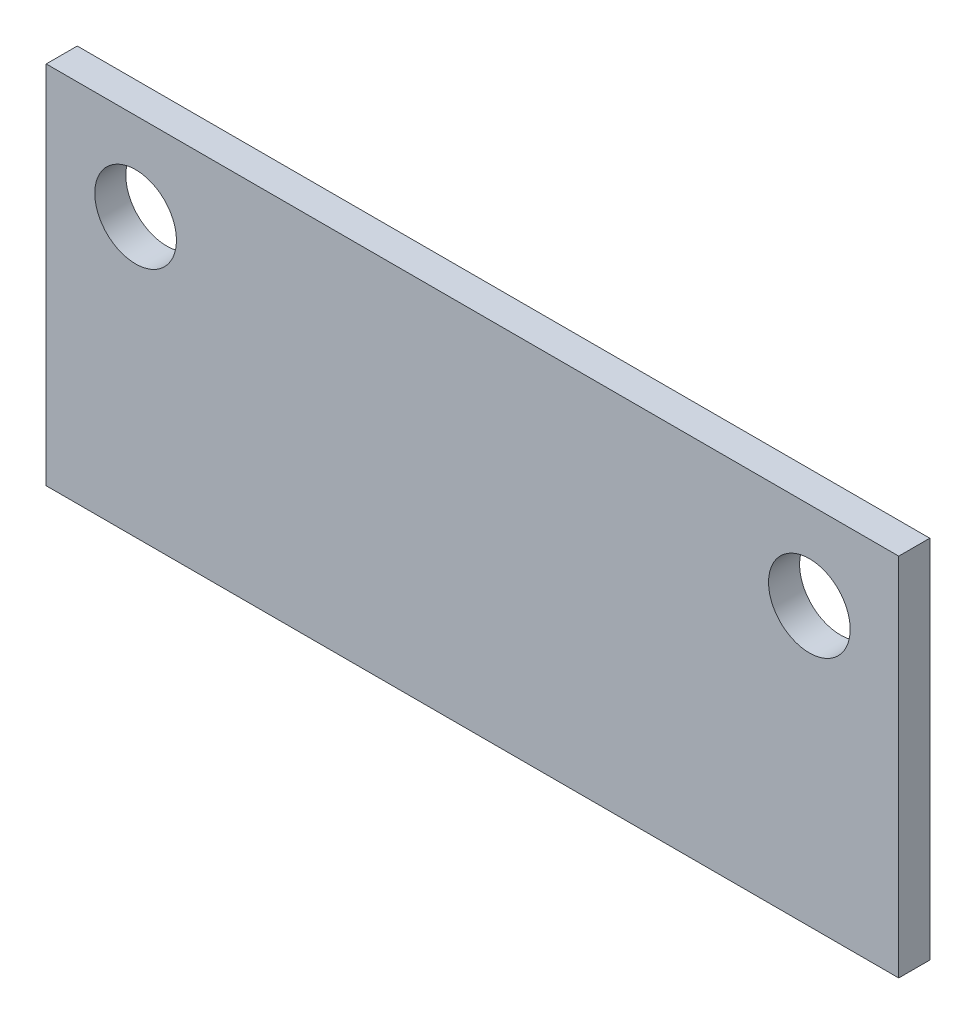
ISO-10303-21;
HEADER;
FILE_DESCRIPTION(('STEP AP214'),'2;1');
FILE_NAME('part.step','',(''),(''),'','','');
FILE_SCHEMA(('AUTOMOTIVE_DESIGN { 1 0 10303 214 1 1 1 1 }'));
ENDSEC;
DATA;
#1=APPLICATION_CONTEXT('core data for automotive mechanical design processes');
#2=APPLICATION_PROTOCOL_DEFINITION('international standard','automotive_design',2000,#1);
#3=PRODUCT_CONTEXT('',#1,'mechanical');
#4=PRODUCT('Part','Part','',(#3));
#5=PRODUCT_RELATED_PRODUCT_CATEGORY('part','',(#4));
#6=PRODUCT_DEFINITION_FORMATION('','',#4);
#7=PRODUCT_DEFINITION_CONTEXT('part definition',#1,'design');
#8=PRODUCT_DEFINITION('design','',#6,#7);
#9=PRODUCT_DEFINITION_SHAPE('','',#8);
#10=(LENGTH_UNIT() NAMED_UNIT(*) SI_UNIT(.MILLI.,.METRE.));
#11=(NAMED_UNIT(*) PLANE_ANGLE_UNIT() SI_UNIT($,.RADIAN.));
#12=(NAMED_UNIT(*) SI_UNIT($,.STERADIAN.) SOLID_ANGLE_UNIT());
#13=UNCERTAINTY_MEASURE_WITH_UNIT(LENGTH_MEASURE(1.E-05),#10,'distance_accuracy_value','');
#14=(GEOMETRIC_REPRESENTATION_CONTEXT(3) GLOBAL_UNCERTAINTY_ASSIGNED_CONTEXT((#13)) GLOBAL_UNIT_ASSIGNED_CONTEXT((#10,
#11,#12)) REPRESENTATION_CONTEXT('',''));
#15=CARTESIAN_POINT('',(0.,0.,0.));
#16=DIRECTION('',(0.,0.,1.));
#17=DIRECTION('',(1.,0.,0.));
#18=AXIS2_PLACEMENT_3D('',#15,#16,#17);
#19=CARTESIAN_POINT('',(0.,0.,0.9652));
#20=DIRECTION('',(0.,0.,-1.));
#21=DIRECTION('',(-1.,0.,0.));
#22=AXIS2_PLACEMENT_3D('',#19,#20,#21);
#23=PLANE('',#22);
#24=DIRECTION('',(0.,-1.,0.));
#25=VECTOR('',#24,1.);
#26=CARTESIAN_POINT('',(0.,0.,0.9652));
#27=LINE('',#26,#25);
#28=CARTESIAN_POINT('',(0.,11.3633355279812,0.9652));
#29=VERTEX_POINT('',#28);
#30=CARTESIAN_POINT('',(0.,0.,0.9652));
#31=VERTEX_POINT('',#30);
#32=EDGE_CURVE('E85',#29,#31,#27,.T.);
#33=ORIENTED_EDGE('',*,*,#32,.T.);
#34=DIRECTION('',(1.,0.,0.));
#35=VECTOR('',#34,1.);
#36=CARTESIAN_POINT('',(0.,0.,0.9652));
#37=LINE('',#36,#35);
#38=CARTESIAN_POINT('',(26.5144495652895,0.,0.9652));
#39=VERTEX_POINT('',#38);
#40=EDGE_CURVE('E80',#31,#39,#37,.T.);
#41=ORIENTED_EDGE('',*,*,#40,.T.);
#42=DIRECTION('',(0.,1.,0.));
#43=VECTOR('',#42,1.);
#44=CARTESIAN_POINT('',(26.5144495652895,0.,0.9652));
#45=LINE('',#44,#43);
#46=CARTESIAN_POINT('',(26.5144495652895,11.3633355279812,0.9652));
#47=VERTEX_POINT('',#46);
#48=EDGE_CURVE('E83',#39,#47,#45,.T.);
#49=ORIENTED_EDGE('',*,*,#48,.T.);
#50=DIRECTION('',(-1.,0.,0.));
#51=VECTOR('',#50,1.);
#52=CARTESIAN_POINT('',(0.,11.3633355279812,0.9652));
#53=LINE('',#52,#51);
#54=EDGE_CURVE('E50',#47,#29,#53,.T.);
#55=ORIENTED_EDGE('',*,*,#54,.T.);
#56=EDGE_LOOP('',(#33,#41,#49,#55));
#57=FACE_BOUND('',#56,.T.);
#58=CARTESIAN_POINT('',(2.77972478264474,8.636,0.9652));
#59=DIRECTION('',(0.,0.,1.));
#60=DIRECTION('',(1.,0.,0.));
#61=AXIS2_PLACEMENT_3D('',#58,#59,#60);
#62=CIRCLE('',#61,1.27);
#63=CARTESIAN_POINT('',(1.50972478264474,8.636,0.9652));
#64=VERTEX_POINT('',#63);
#65=EDGE_CURVE('E100',#64,#64,#62,.T.);
#66=ORIENTED_EDGE('',*,*,#65,.F.);
#67=EDGE_LOOP('',(#66));
#68=FACE_BOUND('',#67,.T.);
#69=CARTESIAN_POINT('',(23.7347247826447,8.636,0.9652));
#70=DIRECTION('',(0.,0.,1.));
#71=DIRECTION('',(1.,0.,0.));
#72=AXIS2_PLACEMENT_3D('',#69,#70,#71);
#73=CIRCLE('',#72,1.27);
#74=CARTESIAN_POINT('',(22.4647247826447,8.636,0.9652));
#75=VERTEX_POINT('',#74);
#76=EDGE_CURVE('E115',#75,#75,#73,.T.);
#77=ORIENTED_EDGE('',*,*,#76,.F.);
#78=EDGE_LOOP('',(#77));
#79=FACE_BOUND('',#78,.T.);
#80=ADVANCED_FACE('F33',(#57,#68,#79),#23,.F.);
#81=CARTESIAN_POINT('',(0.,0.,0.));
#82=DIRECTION('',(0.,0.,-1.));
#83=DIRECTION('',(-1.,0.,0.));
#84=AXIS2_PLACEMENT_3D('',#81,#82,#83);
#85=PLANE('',#84);
#86=CARTESIAN_POINT('',(2.77972478264474,8.636,0.));
#87=DIRECTION('',(0.,0.,1.));
#88=DIRECTION('',(1.,0.,0.));
#89=AXIS2_PLACEMENT_3D('',#86,#87,#88);
#90=CIRCLE('',#89,1.27);
#91=CARTESIAN_POINT('',(1.50972478264474,8.636,0.));
#92=VERTEX_POINT('',#91);
#93=EDGE_CURVE('E112',#92,#92,#90,.T.);
#94=ORIENTED_EDGE('',*,*,#93,.T.);
#95=EDGE_LOOP('',(#94));
#96=FACE_BOUND('',#95,.T.);
#97=DIRECTION('',(0.,-1.,0.));
#98=VECTOR('',#97,1.);
#99=CARTESIAN_POINT('',(0.,0.,0.));
#100=LINE('',#99,#98);
#101=CARTESIAN_POINT('',(0.,11.3633355279812,0.));
#102=VERTEX_POINT('',#101);
#103=CARTESIAN_POINT('',(0.,0.,0.));
#104=VERTEX_POINT('',#103);
#105=EDGE_CURVE('E97',#102,#104,#100,.T.);
#106=ORIENTED_EDGE('',*,*,#105,.F.);
#107=DIRECTION('',(-1.,0.,0.));
#108=VECTOR('',#107,1.);
#109=CARTESIAN_POINT('',(0.,11.3633355279812,0.));
#110=LINE('',#109,#108);
#111=CARTESIAN_POINT('',(26.5144495652895,11.3633355279812,0.));
#112=VERTEX_POINT('',#111);
#113=EDGE_CURVE('E73',#112,#102,#110,.T.);
#114=ORIENTED_EDGE('',*,*,#113,.F.);
#115=DIRECTION('',(0.,1.,0.));
#116=VECTOR('',#115,1.);
#117=CARTESIAN_POINT('',(26.5144495652895,0.,0.));
#118=LINE('',#117,#116);
#119=CARTESIAN_POINT('',(26.5144495652895,0.,0.));
#120=VERTEX_POINT('',#119);
#121=EDGE_CURVE('E67',#120,#112,#118,.T.);
#122=ORIENTED_EDGE('',*,*,#121,.F.);
#123=DIRECTION('',(1.,0.,0.));
#124=VECTOR('',#123,1.);
#125=CARTESIAN_POINT('',(0.,0.,0.));
#126=LINE('',#125,#124);
#127=EDGE_CURVE('E89',#104,#120,#126,.T.);
#128=ORIENTED_EDGE('',*,*,#127,.F.);
#129=EDGE_LOOP('',(#106,#114,#122,#128));
#130=FACE_BOUND('',#129,.T.);
#131=CARTESIAN_POINT('',(23.7347247826447,8.636,0.));
#132=DIRECTION('',(0.,0.,1.));
#133=DIRECTION('',(1.,0.,0.));
#134=AXIS2_PLACEMENT_3D('',#131,#132,#133);
#135=CIRCLE('',#134,1.27);
#136=CARTESIAN_POINT('',(22.4647247826447,8.636,0.));
#137=VERTEX_POINT('',#136);
#138=EDGE_CURVE('E118',#137,#137,#135,.T.);
#139=ORIENTED_EDGE('',*,*,#138,.T.);
#140=EDGE_LOOP('',(#139));
#141=FACE_BOUND('',#140,.T.);
#142=ADVANCED_FACE('F108',(#96,#130,#141),#85,.T.);
#143=CARTESIAN_POINT('',(0.,0.,0.9652));
#144=DIRECTION('',(1.,0.,0.));
#145=DIRECTION('',(0.,0.,-1.));
#146=AXIS2_PLACEMENT_3D('',#143,#144,#145);
#147=PLANE('',#146);
#148=ORIENTED_EDGE('',*,*,#105,.T.);
#149=DIRECTION('',(0.,0.,-1.));
#150=VECTOR('',#149,1.);
#151=CARTESIAN_POINT('',(0.,0.,0.9652));
#152=LINE('',#151,#150);
#153=EDGE_CURVE('E11',#31,#104,#152,.T.);
#154=ORIENTED_EDGE('',*,*,#153,.F.);
#155=ORIENTED_EDGE('',*,*,#32,.F.);
#156=DIRECTION('',(0.,0.,-1.));
#157=VECTOR('',#156,1.);
#158=CARTESIAN_POINT('',(0.,11.3633355279812,0.9652));
#159=LINE('',#158,#157);
#160=EDGE_CURVE('E93',#29,#102,#159,.T.);
#161=ORIENTED_EDGE('',*,*,#160,.T.);
#162=EDGE_LOOP('',(#148,#154,#155,#161));
#163=FACE_BOUND('',#162,.T.);
#164=ADVANCED_FACE('F35',(#163),#147,.F.);
#165=CARTESIAN_POINT('',(0.,0.,0.9652));
#166=DIRECTION('',(0.,1.,0.));
#167=DIRECTION('',(0.,0.,1.));
#168=AXIS2_PLACEMENT_3D('',#165,#166,#167);
#169=PLANE('',#168);
#170=ORIENTED_EDGE('',*,*,#127,.T.);
#171=DIRECTION('',(0.,0.,-1.));
#172=VECTOR('',#171,1.);
#173=CARTESIAN_POINT('',(26.5144495652895,0.,0.9652));
#174=LINE('',#173,#172);
#175=EDGE_CURVE('E42',#39,#120,#174,.T.);
#176=ORIENTED_EDGE('',*,*,#175,.F.);
#177=ORIENTED_EDGE('',*,*,#40,.F.);
#178=ORIENTED_EDGE('',*,*,#153,.T.);
#179=EDGE_LOOP('',(#170,#176,#177,#178));
#180=FACE_BOUND('',#179,.T.);
#181=ADVANCED_FACE('F88',(#180),#169,.F.);
#182=CARTESIAN_POINT('',(26.5144495652895,0.,0.9652));
#183=DIRECTION('',(-1.,0.,0.));
#184=DIRECTION('',(0.,0.,1.));
#185=AXIS2_PLACEMENT_3D('',#182,#183,#184);
#186=PLANE('',#185);
#187=ORIENTED_EDGE('',*,*,#121,.T.);
#188=DIRECTION('',(0.,0.,-1.));
#189=VECTOR('',#188,1.);
#190=CARTESIAN_POINT('',(26.5144495652895,11.3633355279812,0.9652));
#191=LINE('',#190,#189);
#192=EDGE_CURVE('E90',#47,#112,#191,.T.);
#193=ORIENTED_EDGE('',*,*,#192,.F.);
#194=ORIENTED_EDGE('',*,*,#48,.F.);
#195=ORIENTED_EDGE('',*,*,#175,.T.);
#196=EDGE_LOOP('',(#187,#193,#194,#195));
#197=FACE_BOUND('',#196,.T.);
#198=ADVANCED_FACE('F91',(#197),#186,.F.);
#199=CARTESIAN_POINT('',(0.,11.3633355279812,0.9652));
#200=DIRECTION('',(0.,-1.,0.));
#201=DIRECTION('',(0.,0.,-1.));
#202=AXIS2_PLACEMENT_3D('',#199,#200,#201);
#203=PLANE('',#202);
#204=ORIENTED_EDGE('',*,*,#113,.T.);
#205=ORIENTED_EDGE('',*,*,#160,.F.);
#206=ORIENTED_EDGE('',*,*,#54,.F.);
#207=ORIENTED_EDGE('',*,*,#192,.T.);
#208=EDGE_LOOP('',(#204,#205,#206,#207));
#209=FACE_BOUND('',#208,.T.);
#210=ADVANCED_FACE('F105',(#209),#203,.F.);
#211=CARTESIAN_POINT('',(2.77972478264474,8.636,0.9652));
#212=DIRECTION('',(0.,0.,-1.));
#213=DIRECTION('',(-1.,0.,0.));
#214=AXIS2_PLACEMENT_3D('',#211,#212,#213);
#215=CYLINDRICAL_SURFACE('',#214,1.27);
#216=CARTESIAN_POINT('',(1.50972478264474,8.636,0.9652));
#217=CARTESIAN_POINT('',(1.50972478264474,8.636,0.955145833333333));
#218=CARTESIAN_POINT('',(1.50972478264474,8.636,0.945091666666667));
#219=CARTESIAN_POINT('',(1.50972478264474,8.636,0.924983333333333));
#220=CARTESIAN_POINT('',(1.50972478264474,8.636,0.914929166666667));
#221=CARTESIAN_POINT('',(1.50972478264474,8.636,0.894820833333333));
#222=CARTESIAN_POINT('',(1.50972478264474,8.636,0.884766666666667));
#223=CARTESIAN_POINT('',(1.50972478264474,8.636,0.864658333333333));
#224=CARTESIAN_POINT('',(1.50972478264474,8.636,0.854604166666667));
#225=CARTESIAN_POINT('',(1.50972478264474,8.636,0.834495833333333));
#226=CARTESIAN_POINT('',(1.50972478264474,8.636,0.824441666666667));
#227=CARTESIAN_POINT('',(1.50972478264474,8.636,0.804333333333333));
#228=CARTESIAN_POINT('',(1.50972478264474,8.636,0.794279166666667));
#229=CARTESIAN_POINT('',(1.50972478264474,8.636,0.774170833333333));
#230=CARTESIAN_POINT('',(1.50972478264474,8.636,0.764116666666667));
#231=CARTESIAN_POINT('',(1.50972478264474,8.636,0.744008333333333));
#232=CARTESIAN_POINT('',(1.50972478264474,8.636,0.733954166666667));
#233=CARTESIAN_POINT('',(1.50972478264474,8.636,0.713845833333333));
#234=CARTESIAN_POINT('',(1.50972478264474,8.636,0.703791666666667));
#235=CARTESIAN_POINT('',(1.50972478264474,8.636,0.683683333333333));
#236=CARTESIAN_POINT('',(1.50972478264474,8.636,0.673629166666667));
#237=CARTESIAN_POINT('',(1.50972478264474,8.636,0.653520833333333));
#238=CARTESIAN_POINT('',(1.50972478264474,8.636,0.643466666666667));
#239=CARTESIAN_POINT('',(1.50972478264474,8.636,0.623358333333333));
#240=CARTESIAN_POINT('',(1.50972478264474,8.636,0.613304166666667));
#241=CARTESIAN_POINT('',(1.50972478264474,8.636,0.593195833333333));
#242=CARTESIAN_POINT('',(1.50972478264474,8.636,0.583141666666667));
#243=CARTESIAN_POINT('',(1.50972478264474,8.636,0.563033333333333));
#244=CARTESIAN_POINT('',(1.50972478264474,8.636,0.552979166666667));
#245=CARTESIAN_POINT('',(1.50972478264474,8.636,0.532870833333333));
#246=CARTESIAN_POINT('',(1.50972478264474,8.636,0.522816666666667));
#247=CARTESIAN_POINT('',(1.50972478264474,8.636,0.502708333333333));
#248=CARTESIAN_POINT('',(1.50972478264474,8.636,0.492654166666667));
#249=CARTESIAN_POINT('',(1.50972478264474,8.636,0.472545833333333));
#250=CARTESIAN_POINT('',(1.50972478264474,8.636,0.462491666666667));
#251=CARTESIAN_POINT('',(1.50972478264474,8.636,0.442383333333333));
#252=CARTESIAN_POINT('',(1.50972478264474,8.636,0.432329166666667));
#253=CARTESIAN_POINT('',(1.50972478264474,8.636,0.412220833333333));
#254=CARTESIAN_POINT('',(1.50972478264474,8.636,0.402166666666667));
#255=CARTESIAN_POINT('',(1.50972478264474,8.636,0.382058333333333));
#256=CARTESIAN_POINT('',(1.50972478264474,8.636,0.372004166666667));
#257=CARTESIAN_POINT('',(1.50972478264474,8.636,0.351895833333333));
#258=CARTESIAN_POINT('',(1.50972478264474,8.636,0.341841666666667));
#259=CARTESIAN_POINT('',(1.50972478264474,8.636,0.321733333333333));
#260=CARTESIAN_POINT('',(1.50972478264474,8.636,0.311679166666667));
#261=CARTESIAN_POINT('',(1.50972478264474,8.636,0.291570833333333));
#262=CARTESIAN_POINT('',(1.50972478264474,8.636,0.281516666666667));
#263=CARTESIAN_POINT('',(1.50972478264474,8.636,0.261408333333333));
#264=CARTESIAN_POINT('',(1.50972478264474,8.636,0.251354166666667));
#265=CARTESIAN_POINT('',(1.50972478264474,8.636,0.231245833333333));
#266=CARTESIAN_POINT('',(1.50972478264474,8.636,0.221191666666667));
#267=CARTESIAN_POINT('',(1.50972478264474,8.636,0.201083333333333));
#268=CARTESIAN_POINT('',(1.50972478264474,8.636,0.191029166666667));
#269=CARTESIAN_POINT('',(1.50972478264474,8.636,0.170920833333333));
#270=CARTESIAN_POINT('',(1.50972478264474,8.636,0.160866666666667));
#271=CARTESIAN_POINT('',(1.50972478264474,8.636,0.140758333333333));
#272=CARTESIAN_POINT('',(1.50972478264474,8.636,0.130704166666667));
#273=CARTESIAN_POINT('',(1.50972478264474,8.636,0.110595833333333));
#274=CARTESIAN_POINT('',(1.50972478264474,8.636,0.100541666666667));
#275=CARTESIAN_POINT('',(1.50972478264474,8.636,0.0804333333333333));
#276=CARTESIAN_POINT('',(1.50972478264474,8.636,0.0703791666666666));
#277=CARTESIAN_POINT('',(1.50972478264474,8.636,0.0502708333333333));
#278=CARTESIAN_POINT('',(1.50972478264474,8.636,0.0402166666666666));
#279=CARTESIAN_POINT('',(1.50972478264474,8.636,0.0201083333333333));
#280=CARTESIAN_POINT('',(1.50972478264474,8.636,0.0100541666666667));
#281=CARTESIAN_POINT('',(1.50972478264474,8.636,0.));
#282=B_SPLINE_CURVE_WITH_KNOTS('',3,(#216,#217,#218,#219,#220,#221,#222,#223,#224,#225,#226,
#227,#228,#229,#230,#231,#232,#233,#234,#235,#236,#237,#238,#239,#240,#241,#242,#243,#244,#245,
#246,#247,#248,#249,#250,#251,#252,#253,#254,#255,#256,#257,#258,#259,#260,#261,#262,#263,#264,
#265,#266,#267,#268,#269,#270,#271,#272,#273,#274,#275,#276,#277,#278,#279,#280,#281),
.UNSPECIFIED.,.F.,.F.,(4,2,2,2,2,2,2,2,2,2,2,2,2,2,2,2,2,2,2,2,2,2,2,2,2,2,2,2,2,2,2,2,4),(0.,
0.0301625,0.060325,0.0904874999999999,0.12065,0.1508125,0.180975,0.2111375,0.2413,0.2714625,
0.301625,0.3317875,0.36195,0.3921125,0.422275,0.4524375,0.4826,0.5127625,0.542925,0.5730875,
0.60325,0.6334125,0.663575,0.6937375,0.7239,0.7540625,0.784225,0.8143875,0.84455,0.8747125,
0.904875,0.9350375,0.9652),.UNSPECIFIED.);
#283=EDGE_CURVE('BSEAM135',#64,#92,#282,.T.);
#284=ORIENTED_EDGE('',*,*,#65,.T.);
#285=ORIENTED_EDGE('',*,*,#93,.F.);
#286=ORIENTED_EDGE('',*,*,#283,.T.);
#287=ORIENTED_EDGE('',*,*,#283,.F.);
#288=EDGE_LOOP('',(#284,#286,#285,#287));
#289=FACE_BOUND('',#288,.T.);
#290=ADVANCED_FACE('F135',(#289),#215,.F.);
#291=CARTESIAN_POINT('',(23.7347247826447,8.636,0.9652));
#292=DIRECTION('',(0.,0.,-1.));
#293=DIRECTION('',(-1.,0.,0.));
#294=AXIS2_PLACEMENT_3D('',#291,#292,#293);
#295=CYLINDRICAL_SURFACE('',#294,1.27);
#296=CARTESIAN_POINT('',(22.4647247826447,8.636,0.9652));
#297=CARTESIAN_POINT('',(22.4647247826447,8.636,0.955145833333333));
#298=CARTESIAN_POINT('',(22.4647247826447,8.636,0.945091666666667));
#299=CARTESIAN_POINT('',(22.4647247826447,8.636,0.924983333333333));
#300=CARTESIAN_POINT('',(22.4647247826447,8.636,0.914929166666667));
#301=CARTESIAN_POINT('',(22.4647247826447,8.636,0.894820833333333));
#302=CARTESIAN_POINT('',(22.4647247826447,8.636,0.884766666666667));
#303=CARTESIAN_POINT('',(22.4647247826447,8.636,0.864658333333333));
#304=CARTESIAN_POINT('',(22.4647247826447,8.636,0.854604166666667));
#305=CARTESIAN_POINT('',(22.4647247826447,8.636,0.834495833333333));
#306=CARTESIAN_POINT('',(22.4647247826447,8.636,0.824441666666667));
#307=CARTESIAN_POINT('',(22.4647247826447,8.636,0.804333333333333));
#308=CARTESIAN_POINT('',(22.4647247826447,8.636,0.794279166666667));
#309=CARTESIAN_POINT('',(22.4647247826447,8.636,0.774170833333333));
#310=CARTESIAN_POINT('',(22.4647247826447,8.636,0.764116666666667));
#311=CARTESIAN_POINT('',(22.4647247826447,8.636,0.744008333333333));
#312=CARTESIAN_POINT('',(22.4647247826447,8.636,0.733954166666667));
#313=CARTESIAN_POINT('',(22.4647247826447,8.636,0.713845833333333));
#314=CARTESIAN_POINT('',(22.4647247826447,8.636,0.703791666666667));
#315=CARTESIAN_POINT('',(22.4647247826447,8.636,0.683683333333333));
#316=CARTESIAN_POINT('',(22.4647247826447,8.636,0.673629166666667));
#317=CARTESIAN_POINT('',(22.4647247826447,8.636,0.653520833333333));
#318=CARTESIAN_POINT('',(22.4647247826447,8.636,0.643466666666667));
#319=CARTESIAN_POINT('',(22.4647247826447,8.636,0.623358333333333));
#320=CARTESIAN_POINT('',(22.4647247826447,8.636,0.613304166666667));
#321=CARTESIAN_POINT('',(22.4647247826447,8.636,0.593195833333333));
#322=CARTESIAN_POINT('',(22.4647247826447,8.636,0.583141666666667));
#323=CARTESIAN_POINT('',(22.4647247826447,8.636,0.563033333333333));
#324=CARTESIAN_POINT('',(22.4647247826447,8.636,0.552979166666667));
#325=CARTESIAN_POINT('',(22.4647247826447,8.636,0.532870833333333));
#326=CARTESIAN_POINT('',(22.4647247826447,8.636,0.522816666666667));
#327=CARTESIAN_POINT('',(22.4647247826447,8.636,0.502708333333333));
#328=CARTESIAN_POINT('',(22.4647247826447,8.636,0.492654166666667));
#329=CARTESIAN_POINT('',(22.4647247826447,8.636,0.472545833333333));
#330=CARTESIAN_POINT('',(22.4647247826447,8.636,0.462491666666667));
#331=CARTESIAN_POINT('',(22.4647247826447,8.636,0.442383333333333));
#332=CARTESIAN_POINT('',(22.4647247826447,8.636,0.432329166666667));
#333=CARTESIAN_POINT('',(22.4647247826447,8.636,0.412220833333333));
#334=CARTESIAN_POINT('',(22.4647247826447,8.636,0.402166666666667));
#335=CARTESIAN_POINT('',(22.4647247826447,8.636,0.382058333333333));
#336=CARTESIAN_POINT('',(22.4647247826447,8.636,0.372004166666667));
#337=CARTESIAN_POINT('',(22.4647247826447,8.636,0.351895833333333));
#338=CARTESIAN_POINT('',(22.4647247826447,8.636,0.341841666666667));
#339=CARTESIAN_POINT('',(22.4647247826447,8.636,0.321733333333333));
#340=CARTESIAN_POINT('',(22.4647247826447,8.636,0.311679166666667));
#341=CARTESIAN_POINT('',(22.4647247826447,8.636,0.291570833333333));
#342=CARTESIAN_POINT('',(22.4647247826447,8.636,0.281516666666667));
#343=CARTESIAN_POINT('',(22.4647247826447,8.636,0.261408333333333));
#344=CARTESIAN_POINT('',(22.4647247826447,8.636,0.251354166666667));
#345=CARTESIAN_POINT('',(22.4647247826447,8.636,0.231245833333333));
#346=CARTESIAN_POINT('',(22.4647247826447,8.636,0.221191666666667));
#347=CARTESIAN_POINT('',(22.4647247826447,8.636,0.201083333333333));
#348=CARTESIAN_POINT('',(22.4647247826447,8.636,0.191029166666667));
#349=CARTESIAN_POINT('',(22.4647247826447,8.636,0.170920833333333));
#350=CARTESIAN_POINT('',(22.4647247826447,8.636,0.160866666666667));
#351=CARTESIAN_POINT('',(22.4647247826447,8.636,0.140758333333333));
#352=CARTESIAN_POINT('',(22.4647247826447,8.636,0.130704166666667));
#353=CARTESIAN_POINT('',(22.4647247826447,8.636,0.110595833333333));
#354=CARTESIAN_POINT('',(22.4647247826447,8.636,0.100541666666667));
#355=CARTESIAN_POINT('',(22.4647247826447,8.636,0.0804333333333333));
#356=CARTESIAN_POINT('',(22.4647247826447,8.636,0.0703791666666666));
#357=CARTESIAN_POINT('',(22.4647247826447,8.636,0.0502708333333333));
#358=CARTESIAN_POINT('',(22.4647247826447,8.636,0.0402166666666666));
#359=CARTESIAN_POINT('',(22.4647247826447,8.636,0.0201083333333333));
#360=CARTESIAN_POINT('',(22.4647247826447,8.636,0.0100541666666667));
#361=CARTESIAN_POINT('',(22.4647247826447,8.636,0.));
#362=B_SPLINE_CURVE_WITH_KNOTS('',3,(#296,#297,#298,#299,#300,#301,#302,#303,#304,#305,#306,
#307,#308,#309,#310,#311,#312,#313,#314,#315,#316,#317,#318,#319,#320,#321,#322,#323,#324,#325,
#326,#327,#328,#329,#330,#331,#332,#333,#334,#335,#336,#337,#338,#339,#340,#341,#342,#343,#344,
#345,#346,#347,#348,#349,#350,#351,#352,#353,#354,#355,#356,#357,#358,#359,#360,#361),
.UNSPECIFIED.,.F.,.F.,(4,2,2,2,2,2,2,2,2,2,2,2,2,2,2,2,2,2,2,2,2,2,2,2,2,2,2,2,2,2,2,2,4),(0.,
0.0301625,0.060325,0.0904874999999999,0.12065,0.1508125,0.180975,0.2111375,0.2413,0.2714625,
0.301625,0.3317875,0.36195,0.3921125,0.422275,0.4524375,0.4826,0.5127625,0.542925,0.5730875,
0.60325,0.6334125,0.663575,0.6937375,0.7239,0.7540625,0.784225,0.8143875,0.84455,0.8747125,
0.904875,0.9350375,0.9652),.UNSPECIFIED.);
#363=EDGE_CURVE('BSEAM124',#75,#137,#362,.T.);
#364=ORIENTED_EDGE('',*,*,#76,.T.);
#365=ORIENTED_EDGE('',*,*,#138,.F.);
#366=ORIENTED_EDGE('',*,*,#363,.T.);
#367=ORIENTED_EDGE('',*,*,#363,.F.);
#368=EDGE_LOOP('',(#364,#366,#365,#367));
#369=FACE_BOUND('',#368,.T.);
#370=ADVANCED_FACE('F124',(#369),#295,.F.);
#371=CLOSED_SHELL('',(#80,#142,#164,#181,#198,#210,#290,#370));
#372=MANIFOLD_SOLID_BREP('B2',#371);
#373=ADVANCED_BREP_SHAPE_REPRESENTATION('',(#18,#372),#14);
#374=SHAPE_DEFINITION_REPRESENTATION(#9,#373);
ENDSEC;
END-ISO-10303-21;
